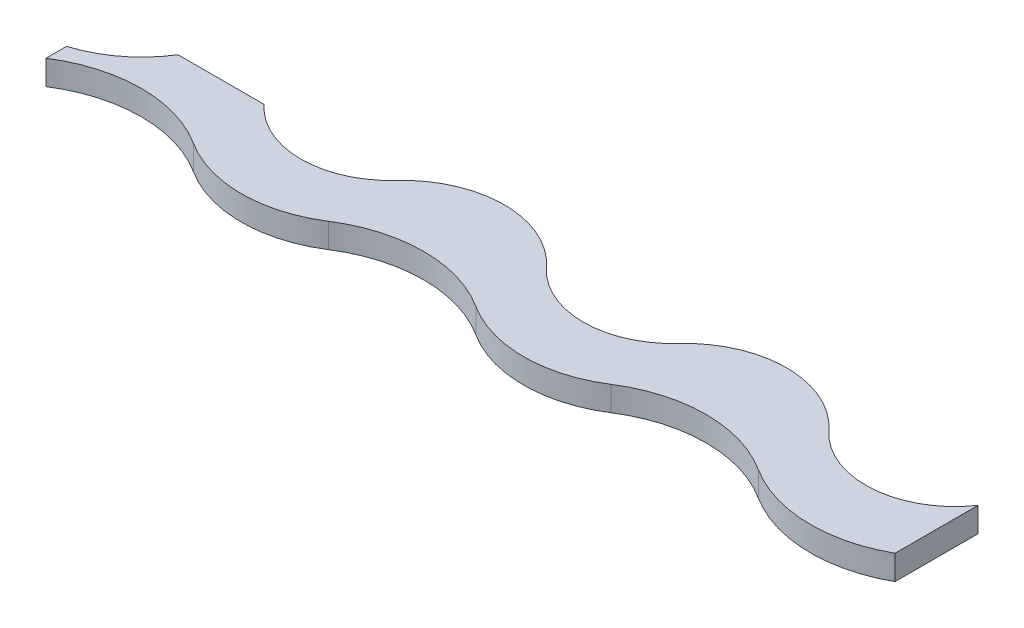
ISO-10303-21;
HEADER;
FILE_DESCRIPTION(('STEP AP214'),'2;1');
FILE_NAME('part.step','',(''),(''),'','','');
FILE_SCHEMA(('AUTOMOTIVE_DESIGN { 1 0 10303 214 1 1 1 1 }'));
ENDSEC;
DATA;
#1=APPLICATION_CONTEXT('core data for automotive mechanical design processes');
#2=APPLICATION_PROTOCOL_DEFINITION('international standard','automotive_design',2000,#1);
#3=PRODUCT_CONTEXT('',#1,'mechanical');
#4=PRODUCT('Part','Part','',(#3));
#5=PRODUCT_RELATED_PRODUCT_CATEGORY('part','',(#4));
#6=PRODUCT_DEFINITION_FORMATION('','',#4);
#7=PRODUCT_DEFINITION_CONTEXT('part definition',#1,'design');
#8=PRODUCT_DEFINITION('design','',#6,#7);
#9=PRODUCT_DEFINITION_SHAPE('','',#8);
#10=(LENGTH_UNIT() NAMED_UNIT(*) SI_UNIT(.MILLI.,.METRE.));
#11=(NAMED_UNIT(*) PLANE_ANGLE_UNIT() SI_UNIT($,.RADIAN.));
#12=(NAMED_UNIT(*) SI_UNIT($,.STERADIAN.) SOLID_ANGLE_UNIT());
#13=UNCERTAINTY_MEASURE_WITH_UNIT(LENGTH_MEASURE(1.E-05),#10,'distance_accuracy_value','');
#14=(GEOMETRIC_REPRESENTATION_CONTEXT(3) GLOBAL_UNCERTAINTY_ASSIGNED_CONTEXT((#13)) GLOBAL_UNIT_ASSIGNED_CONTEXT((#10,
#11,#12)) REPRESENTATION_CONTEXT('',''));
#15=CARTESIAN_POINT('',(0.,0.,0.));
#16=DIRECTION('',(0.,0.,1.));
#17=DIRECTION('',(1.,0.,0.));
#18=AXIS2_PLACEMENT_3D('',#15,#16,#17);
#19=CARTESIAN_POINT('',(57.37,2.,-19.8781689297581));
#20=DIRECTION('',(0.,-1.,0.));
#21=DIRECTION('',(0.,0.,-1.));
#22=AXIS2_PLACEMENT_3D('',#19,#20,#21);
#23=CYLINDRICAL_SURFACE('',#22,7.25);
#24=CARTESIAN_POINT('',(57.37,0.,-19.8781689297581));
#25=DIRECTION('',(0.,1.,0.));
#26=DIRECTION('',(0.,0.,1.));
#27=AXIS2_PLACEMENT_3D('',#24,#25,#26);
#28=CIRCLE('',#27,7.25);
#29=CARTESIAN_POINT('',(52.0205387347556,0.,-14.9847279960541));
#30=VERTEX_POINT('',#29);
#31=CARTESIAN_POINT('',(63.34697854301,0.,-15.7747279960541));
#32=VERTEX_POINT('',#31);
#33=EDGE_CURVE('E195',#30,#32,#28,.T.);
#34=ORIENTED_EDGE('',*,*,#33,.F.);
#35=DIRECTION('',(0.,-1.,0.));
#36=VECTOR('',#35,1.);
#37=CARTESIAN_POINT('',(52.0205387347556,2.,-14.9847279960541));
#38=LINE('',#37,#36);
#39=CARTESIAN_POINT('',(52.0205387347556,2.,-14.9847279960541));
#40=VERTEX_POINT('',#39);
#41=EDGE_CURVE('E11',#40,#30,#38,.T.);
#42=ORIENTED_EDGE('',*,*,#41,.F.);
#43=CARTESIAN_POINT('',(57.37,2.,-19.8781689297581));
#44=DIRECTION('',(0.,1.,0.));
#45=DIRECTION('',(0.,0.,1.));
#46=AXIS2_PLACEMENT_3D('',#43,#44,#45);
#47=CIRCLE('',#46,7.25);
#48=CARTESIAN_POINT('',(63.34697854301,2.,-15.7747279960541));
#49=VERTEX_POINT('',#48);
#50=EDGE_CURVE('E243',#40,#49,#47,.T.);
#51=ORIENTED_EDGE('',*,*,#50,.T.);
#52=DIRECTION('',(0.,-1.,0.));
#53=VECTOR('',#52,1.);
#54=CARTESIAN_POINT('',(63.34697854301,2.,-15.7747279960541));
#55=LINE('',#54,#53);
#56=EDGE_CURVE('E52',#49,#32,#55,.T.);
#57=ORIENTED_EDGE('',*,*,#56,.T.);
#58=EDGE_LOOP('',(#34,#42,#51,#57));
#59=FACE_BOUND('',#58,.T.);
#60=ADVANCED_FACE('F49',(#59),#23,.F.);
#61=CARTESIAN_POINT('',(45.895,2.,-9.3813671155125));
#62=DIRECTION('',(0.,-1.,0.));
#63=DIRECTION('',(0.,0.,-1.));
#64=AXIS2_PLACEMENT_3D('',#61,#62,#63);
#65=CYLINDRICAL_SURFACE('',#64,8.30179968130858);
#66=CARTESIAN_POINT('',(45.895,0.,-9.3813671155125));
#67=DIRECTION('',(0.,1.,0.));
#68=DIRECTION('',(0.,0.,1.));
#69=AXIS2_PLACEMENT_3D('',#66,#67,#68);
#70=CIRCLE('',#69,8.30179968130858);
#71=CARTESIAN_POINT('',(39.7694612652444,0.,-14.9847279960541));
#72=VERTEX_POINT('',#71);
#73=EDGE_CURVE('E116',#30,#72,#70,.T.);
#74=ORIENTED_EDGE('',*,*,#73,.T.);
#75=DIRECTION('',(0.,-1.,0.));
#76=VECTOR('',#75,1.);
#77=CARTESIAN_POINT('',(39.7694612652444,2.,-14.9847279960541));
#78=LINE('',#77,#76);
#79=CARTESIAN_POINT('',(39.7694612652444,2.,-14.9847279960541));
#80=VERTEX_POINT('',#79);
#81=EDGE_CURVE('E59',#80,#72,#78,.T.);
#82=ORIENTED_EDGE('',*,*,#81,.F.);
#83=CARTESIAN_POINT('',(45.895,2.,-9.3813671155125));
#84=DIRECTION('',(0.,1.,0.));
#85=DIRECTION('',(0.,0.,1.));
#86=AXIS2_PLACEMENT_3D('',#83,#84,#85);
#87=CIRCLE('',#86,8.30179968130858);
#88=EDGE_CURVE('E168',#40,#80,#87,.T.);
#89=ORIENTED_EDGE('',*,*,#88,.F.);
#90=ORIENTED_EDGE('',*,*,#41,.T.);
#91=EDGE_LOOP('',(#74,#82,#89,#90));
#92=FACE_BOUND('',#91,.T.);
#93=ADVANCED_FACE('F375',(#92),#65,.T.);
#94=CARTESIAN_POINT('',(34.42,2.,-19.8781689297581));
#95=DIRECTION('',(0.,-1.,0.));
#96=DIRECTION('',(0.,0.,-1.));
#97=AXIS2_PLACEMENT_3D('',#94,#95,#96);
#98=CYLINDRICAL_SURFACE('',#97,7.25);
#99=CARTESIAN_POINT('',(34.42,0.,-19.8781689297581));
#100=DIRECTION('',(0.,-1.,0.));
#101=DIRECTION('',(0.,0.,-1.));
#102=AXIS2_PLACEMENT_3D('',#99,#100,#101);
#103=CIRCLE('',#102,7.25);
#104=CARTESIAN_POINT('',(29.0705387347556,0.,-14.9847279960541));
#105=VERTEX_POINT('',#104);
#106=EDGE_CURVE('E176',#72,#105,#103,.T.);
#107=ORIENTED_EDGE('',*,*,#106,.T.);
#108=DIRECTION('',(0.,-1.,0.));
#109=VECTOR('',#108,1.);
#110=CARTESIAN_POINT('',(29.0705387347556,2.,-14.9847279960541));
#111=LINE('',#110,#109);
#112=CARTESIAN_POINT('',(29.0705387347556,2.,-14.9847279960541));
#113=VERTEX_POINT('',#112);
#114=EDGE_CURVE('E173',#113,#105,#111,.T.);
#115=ORIENTED_EDGE('',*,*,#114,.F.);
#116=CARTESIAN_POINT('',(34.42,2.,-19.8781689297581));
#117=DIRECTION('',(0.,-1.,0.));
#118=DIRECTION('',(0.,0.,-1.));
#119=AXIS2_PLACEMENT_3D('',#116,#117,#118);
#120=CIRCLE('',#119,7.25);
#121=EDGE_CURVE('E161',#80,#113,#120,.T.);
#122=ORIENTED_EDGE('',*,*,#121,.F.);
#123=ORIENTED_EDGE('',*,*,#81,.T.);
#124=EDGE_LOOP('',(#107,#115,#122,#123));
#125=FACE_BOUND('',#124,.T.);
#126=ADVANCED_FACE('F174',(#125),#98,.F.);
#127=CARTESIAN_POINT('',(22.945,2.,-9.38136711551249));
#128=DIRECTION('',(0.,-1.,0.));
#129=DIRECTION('',(0.,0.,-1.));
#130=AXIS2_PLACEMENT_3D('',#127,#128,#129);
#131=CYLINDRICAL_SURFACE('',#130,8.30179968130858);
#132=CARTESIAN_POINT('',(22.945,0.,-9.38136711551249));
#133=DIRECTION('',(0.,1.,0.));
#134=DIRECTION('',(0.,0.,1.));
#135=AXIS2_PLACEMENT_3D('',#132,#133,#134);
#136=CIRCLE('',#135,8.30179968130858);
#137=CARTESIAN_POINT('',(16.8194612652444,0.,-14.9847279960541));
#138=VERTEX_POINT('',#137);
#139=EDGE_CURVE('E237',#105,#138,#136,.T.);
#140=ORIENTED_EDGE('',*,*,#139,.T.);
#141=DIRECTION('',(0.,-1.,0.));
#142=VECTOR('',#141,1.);
#143=CARTESIAN_POINT('',(16.8194612652444,2.,-14.9847279960541));
#144=LINE('',#143,#142);
#145=CARTESIAN_POINT('',(16.8194612652444,2.,-14.9847279960541));
#146=VERTEX_POINT('',#145);
#147=EDGE_CURVE('E180',#146,#138,#144,.T.);
#148=ORIENTED_EDGE('',*,*,#147,.F.);
#149=CARTESIAN_POINT('',(22.945,2.,-9.38136711551249));
#150=DIRECTION('',(0.,1.,0.));
#151=DIRECTION('',(0.,0.,1.));
#152=AXIS2_PLACEMENT_3D('',#149,#150,#151);
#153=CIRCLE('',#152,8.30179968130858);
#154=EDGE_CURVE('E166',#113,#146,#153,.T.);
#155=ORIENTED_EDGE('',*,*,#154,.F.);
#156=ORIENTED_EDGE('',*,*,#114,.T.);
#157=EDGE_LOOP('',(#140,#148,#155,#156));
#158=FACE_BOUND('',#157,.T.);
#159=ADVANCED_FACE('F182',(#158),#131,.T.);
#160=CARTESIAN_POINT('',(11.47,2.,-19.8781689297581));
#161=DIRECTION('',(0.,-1.,0.));
#162=DIRECTION('',(0.,0.,-1.));
#163=AXIS2_PLACEMENT_3D('',#160,#161,#162);
#164=CYLINDRICAL_SURFACE('',#163,7.25);
#165=CARTESIAN_POINT('',(11.47,0.,-19.8781689297581));
#166=DIRECTION('',(0.,-1.,0.));
#167=DIRECTION('',(0.,0.,-1.));
#168=AXIS2_PLACEMENT_3D('',#165,#166,#167);
#169=CIRCLE('',#168,7.25);
#170=CARTESIAN_POINT('',(6.12053873475563,0.,-14.9847279960541));
#171=VERTEX_POINT('',#170);
#172=EDGE_CURVE('E234',#138,#171,#169,.T.);
#173=ORIENTED_EDGE('',*,*,#172,.T.);
#174=DIRECTION('',(0.,-1.,0.));
#175=VECTOR('',#174,1.);
#176=CARTESIAN_POINT('',(6.12053873475563,2.,-14.9847279960541));
#177=LINE('',#176,#175);
#178=CARTESIAN_POINT('',(6.12053873475563,2.,-14.9847279960541));
#179=VERTEX_POINT('',#178);
#180=EDGE_CURVE('E249',#179,#171,#177,.T.);
#181=ORIENTED_EDGE('',*,*,#180,.F.);
#182=CARTESIAN_POINT('',(11.47,2.,-19.8781689297581));
#183=DIRECTION('',(0.,-1.,0.));
#184=DIRECTION('',(0.,0.,-1.));
#185=AXIS2_PLACEMENT_3D('',#182,#183,#184);
#186=CIRCLE('',#185,7.25);
#187=EDGE_CURVE('E186',#146,#179,#186,.T.);
#188=ORIENTED_EDGE('',*,*,#187,.F.);
#189=ORIENTED_EDGE('',*,*,#147,.T.);
#190=EDGE_LOOP('',(#173,#181,#188,#189));
#191=FACE_BOUND('',#190,.T.);
#192=ADVANCED_FACE('F292',(#191),#164,.F.);
#193=CARTESIAN_POINT('',(6.12053873475563,2.,-14.9847279960541));
#194=DIRECTION('',(0.,0.,1.));
#195=DIRECTION('',(1.,0.,0.));
#196=AXIS2_PLACEMENT_3D('',#193,#194,#195);
#197=PLANE('',#196);
#198=DIRECTION('',(-1.,0.,0.));
#199=VECTOR('',#198,1.);
#200=CARTESIAN_POINT('',(6.12053873475563,0.,-14.9847279960541));
#201=LINE('',#200,#199);
#202=CARTESIAN_POINT('',(-0.867605228750022,0.,-14.9847279960541));
#203=VERTEX_POINT('',#202);
#204=EDGE_CURVE('E231',#171,#203,#201,.T.);
#205=ORIENTED_EDGE('',*,*,#204,.T.);
#206=DIRECTION('',(0.,-1.,0.));
#207=VECTOR('',#206,1.);
#208=CARTESIAN_POINT('',(-0.867605228750022,2.,-14.9847279960541));
#209=LINE('',#208,#207);
#210=CARTESIAN_POINT('',(-0.867605228750022,2.,-14.9847279960541));
#211=VERTEX_POINT('',#210);
#212=EDGE_CURVE('E253',#211,#203,#209,.T.);
#213=ORIENTED_EDGE('',*,*,#212,.F.);
#214=DIRECTION('',(-1.,0.,0.));
#215=VECTOR('',#214,1.);
#216=CARTESIAN_POINT('',(6.12053873475563,2.,-14.9847279960541));
#217=LINE('',#216,#215);
#218=EDGE_CURVE('E189',#179,#211,#217,.T.);
#219=ORIENTED_EDGE('',*,*,#218,.F.);
#220=ORIENTED_EDGE('',*,*,#180,.T.);
#221=EDGE_LOOP('',(#205,#213,#219,#220));
#222=FACE_BOUND('',#221,.T.);
#223=ADVANCED_FACE('F302',(#222),#197,.F.);
#224=CARTESIAN_POINT('',(-8.71308502894414,2.,-19.8848245976269));
#225=DIRECTION('',(0.,-1.,0.));
#226=DIRECTION('',(0.,0.,-1.));
#227=AXIS2_PLACEMENT_3D('',#224,#225,#226);
#228=CYLINDRICAL_SURFACE('',#227,9.25);
#229=CARTESIAN_POINT('',(-8.71308502894414,0.,-19.8848245976269));
#230=DIRECTION('',(0.,-1.,0.));
#231=DIRECTION('',(0.,0.,-1.));
#232=AXIS2_PLACEMENT_3D('',#229,#230,#231);
#233=CIRCLE('',#232,9.25);
#234=CARTESIAN_POINT('',(-5.99,0.,-11.0447279960541));
#235=VERTEX_POINT('',#234);
#236=EDGE_CURVE('E227',#203,#235,#233,.T.);
#237=ORIENTED_EDGE('',*,*,#236,.T.);
#238=DIRECTION('',(0.,-1.,0.));
#239=VECTOR('',#238,1.);
#240=CARTESIAN_POINT('',(-5.99,2.,-11.0447279960541));
#241=LINE('',#240,#239);
#242=CARTESIAN_POINT('',(-5.99,2.,-11.0447279960541));
#243=VERTEX_POINT('',#242);
#244=EDGE_CURVE('E257',#243,#235,#241,.T.);
#245=ORIENTED_EDGE('',*,*,#244,.F.);
#246=CARTESIAN_POINT('',(-8.71308502894414,2.,-19.8848245976269));
#247=DIRECTION('',(0.,-1.,0.));
#248=DIRECTION('',(0.,0.,-1.));
#249=AXIS2_PLACEMENT_3D('',#246,#247,#248);
#250=CIRCLE('',#249,9.25);
#251=EDGE_CURVE('E298',#211,#243,#250,.T.);
#252=ORIENTED_EDGE('',*,*,#251,.F.);
#253=ORIENTED_EDGE('',*,*,#212,.T.);
#254=EDGE_LOOP('',(#237,#245,#252,#253));
#255=FACE_BOUND('',#254,.T.);
#256=ADVANCED_FACE('F305',(#255),#228,.F.);
#257=CARTESIAN_POINT('',(-5.99,2.,-9.37472799605407));
#258=DIRECTION('',(-1.,0.,0.));
#259=DIRECTION('',(0.,0.,1.));
#260=AXIS2_PLACEMENT_3D('',#257,#258,#259);
#261=PLANE('',#260);
#262=DIRECTION('',(0.,0.,-1.));
#263=VECTOR('',#262,1.);
#264=CARTESIAN_POINT('',(-5.99,0.,-9.37472799605407));
#265=LINE('',#264,#263);
#266=CARTESIAN_POINT('',(-5.99,0.,-9.37472799605407));
#267=VERTEX_POINT('',#266);
#268=EDGE_CURVE('E223',#267,#235,#265,.T.);
#269=ORIENTED_EDGE('',*,*,#268,.F.);
#270=DIRECTION('',(0.,-1.,0.));
#271=VECTOR('',#270,1.);
#272=CARTESIAN_POINT('',(-5.99,2.,-9.37472799605407));
#273=LINE('',#272,#271);
#274=CARTESIAN_POINT('',(-5.99,2.,-9.37472799605407));
#275=VERTEX_POINT('',#274);
#276=EDGE_CURVE('E260',#275,#267,#273,.T.);
#277=ORIENTED_EDGE('',*,*,#276,.F.);
#278=DIRECTION('',(0.,0.,-1.));
#279=VECTOR('',#278,1.);
#280=CARTESIAN_POINT('',(-5.99,2.,-9.37472799605407));
#281=LINE('',#280,#279);
#282=EDGE_CURVE('E308',#275,#243,#281,.T.);
#283=ORIENTED_EDGE('',*,*,#282,.T.);
#284=ORIENTED_EDGE('',*,*,#244,.T.);
#285=EDGE_LOOP('',(#269,#277,#283,#284));
#286=FACE_BOUND('',#285,.T.);
#287=ADVANCED_FACE('F364',(#286),#261,.T.);
#288=CARTESIAN_POINT('',(0.,2.,0.));
#289=DIRECTION('',(0.,-1.,0.));
#290=DIRECTION('',(0.,0.,-1.));
#291=AXIS2_PLACEMENT_3D('',#288,#289,#290);
#292=CYLINDRICAL_SURFACE('',#291,11.125);
#293=CARTESIAN_POINT('',(0.,0.,0.));
#294=DIRECTION('',(0.,1.,0.));
#295=DIRECTION('',(0.,0.,1.));
#296=AXIS2_PLACEMENT_3D('',#293,#294,#295);
#297=CIRCLE('',#296,11.125);
#298=CARTESIAN_POINT('',(5.99,0.,-9.37472799605407));
#299=VERTEX_POINT('',#298);
#300=EDGE_CURVE('E219',#299,#267,#297,.T.);
#301=ORIENTED_EDGE('',*,*,#300,.F.);
#302=DIRECTION('',(0.,-1.,0.));
#303=VECTOR('',#302,1.);
#304=CARTESIAN_POINT('',(5.99,2.,-9.37472799605407));
#305=LINE('',#304,#303);
#306=CARTESIAN_POINT('',(5.99,2.,-9.37472799605407));
#307=VERTEX_POINT('',#306);
#308=EDGE_CURVE('E263',#307,#299,#305,.T.);
#309=ORIENTED_EDGE('',*,*,#308,.F.);
#310=CARTESIAN_POINT('',(0.,2.,0.));
#311=DIRECTION('',(0.,1.,0.));
#312=DIRECTION('',(0.,0.,1.));
#313=AXIS2_PLACEMENT_3D('',#310,#311,#312);
#314=CIRCLE('',#313,11.125);
#315=EDGE_CURVE('E311',#307,#275,#314,.T.);
#316=ORIENTED_EDGE('',*,*,#315,.T.);
#317=ORIENTED_EDGE('',*,*,#276,.T.);
#318=EDGE_LOOP('',(#301,#309,#316,#317));
#319=FACE_BOUND('',#318,.T.);
#320=ADVANCED_FACE('F359',(#319),#292,.F.);
#321=CARTESIAN_POINT('',(11.475,2.,-17.9590991243273));
#322=DIRECTION('',(0.,-1.,0.));
#323=DIRECTION('',(0.,0.,-1.));
#324=AXIS2_PLACEMENT_3D('',#321,#322,#323);
#325=CYLINDRICAL_SURFACE('',#324,10.1870826377295);
#326=CARTESIAN_POINT('',(11.475,0.,-17.9590991243273));
#327=DIRECTION('',(0.,1.,0.));
#328=DIRECTION('',(0.,0.,1.));
#329=AXIS2_PLACEMENT_3D('',#326,#327,#328);
#330=CIRCLE('',#329,10.1870826377295);
#331=CARTESIAN_POINT('',(16.96,0.,-9.37472799605407));
#332=VERTEX_POINT('',#331);
#333=EDGE_CURVE('E216',#299,#332,#330,.T.);
#334=ORIENTED_EDGE('',*,*,#333,.T.);
#335=DIRECTION('',(0.,-1.,0.));
#336=VECTOR('',#335,1.);
#337=CARTESIAN_POINT('',(16.96,2.,-9.37472799605407));
#338=LINE('',#337,#336);
#339=CARTESIAN_POINT('',(16.96,2.,-9.37472799605407));
#340=VERTEX_POINT('',#339);
#341=EDGE_CURVE('E266',#340,#332,#338,.T.);
#342=ORIENTED_EDGE('',*,*,#341,.F.);
#343=CARTESIAN_POINT('',(11.475,2.,-17.9590991243273));
#344=DIRECTION('',(0.,1.,0.));
#345=DIRECTION('',(0.,0.,1.));
#346=AXIS2_PLACEMENT_3D('',#343,#344,#345);
#347=CIRCLE('',#346,10.1870826377295);
#348=EDGE_CURVE('E317',#307,#340,#347,.T.);
#349=ORIENTED_EDGE('',*,*,#348,.F.);
#350=ORIENTED_EDGE('',*,*,#308,.T.);
#351=EDGE_LOOP('',(#334,#342,#349,#350));
#352=FACE_BOUND('',#351,.T.);
#353=ADVANCED_FACE('F365',(#352),#325,.T.);
#354=CARTESIAN_POINT('',(22.95,2.,0.));
#355=DIRECTION('',(0.,-1.,0.));
#356=DIRECTION('',(0.,0.,-1.));
#357=AXIS2_PLACEMENT_3D('',#354,#355,#356);
#358=CYLINDRICAL_SURFACE('',#357,11.125);
#359=CARTESIAN_POINT('',(22.95,0.,0.));
#360=DIRECTION('',(0.,-1.,0.));
#361=DIRECTION('',(0.,0.,-1.));
#362=AXIS2_PLACEMENT_3D('',#359,#360,#361);
#363=CIRCLE('',#362,11.125);
#364=CARTESIAN_POINT('',(28.94,0.,-9.37472799605407));
#365=VERTEX_POINT('',#364);
#366=EDGE_CURVE('E213',#332,#365,#363,.T.);
#367=ORIENTED_EDGE('',*,*,#366,.T.);
#368=DIRECTION('',(0.,-1.,0.));
#369=VECTOR('',#368,1.);
#370=CARTESIAN_POINT('',(28.94,2.,-9.37472799605407));
#371=LINE('',#370,#369);
#372=CARTESIAN_POINT('',(28.94,2.,-9.37472799605407));
#373=VERTEX_POINT('',#372);
#374=EDGE_CURVE('E270',#373,#365,#371,.T.);
#375=ORIENTED_EDGE('',*,*,#374,.F.);
#376=CARTESIAN_POINT('',(22.95,2.,0.));
#377=DIRECTION('',(0.,-1.,0.));
#378=DIRECTION('',(0.,0.,-1.));
#379=AXIS2_PLACEMENT_3D('',#376,#377,#378);
#380=CIRCLE('',#379,11.125);
#381=EDGE_CURVE('E320',#340,#373,#380,.T.);
#382=ORIENTED_EDGE('',*,*,#381,.F.);
#383=ORIENTED_EDGE('',*,*,#341,.T.);
#384=EDGE_LOOP('',(#367,#375,#382,#383));
#385=FACE_BOUND('',#384,.T.);
#386=ADVANCED_FACE('F353',(#385),#358,.F.);
#387=CARTESIAN_POINT('',(34.425,2.,-17.9590991243273));
#388=DIRECTION('',(0.,-1.,0.));
#389=DIRECTION('',(0.,0.,-1.));
#390=AXIS2_PLACEMENT_3D('',#387,#388,#389);
#391=CYLINDRICAL_SURFACE('',#390,10.1870826377295);
#392=CARTESIAN_POINT('',(34.425,0.,-17.9590991243273));
#393=DIRECTION('',(0.,1.,0.));
#394=DIRECTION('',(0.,0.,1.));
#395=AXIS2_PLACEMENT_3D('',#392,#393,#394);
#396=CIRCLE('',#395,10.1870826377295);
#397=CARTESIAN_POINT('',(39.91,0.,-9.37472799605407));
#398=VERTEX_POINT('',#397);
#399=EDGE_CURVE('E210',#365,#398,#396,.T.);
#400=ORIENTED_EDGE('',*,*,#399,.T.);
#401=DIRECTION('',(0.,-1.,0.));
#402=VECTOR('',#401,1.);
#403=CARTESIAN_POINT('',(39.91,2.,-9.37472799605407));
#404=LINE('',#403,#402);
#405=CARTESIAN_POINT('',(39.91,2.,-9.37472799605407));
#406=VERTEX_POINT('',#405);
#407=EDGE_CURVE('E274',#406,#398,#404,.T.);
#408=ORIENTED_EDGE('',*,*,#407,.F.);
#409=CARTESIAN_POINT('',(34.425,2.,-17.9590991243273));
#410=DIRECTION('',(0.,1.,0.));
#411=DIRECTION('',(0.,0.,1.));
#412=AXIS2_PLACEMENT_3D('',#409,#410,#411);
#413=CIRCLE('',#412,10.1870826377295);
#414=EDGE_CURVE('E323',#373,#406,#413,.T.);
#415=ORIENTED_EDGE('',*,*,#414,.F.);
#416=ORIENTED_EDGE('',*,*,#374,.T.);
#417=EDGE_LOOP('',(#400,#408,#415,#416));
#418=FACE_BOUND('',#417,.T.);
#419=ADVANCED_FACE('F349',(#418),#391,.T.);
#420=CARTESIAN_POINT('',(45.9,2.,0.));
#421=DIRECTION('',(0.,-1.,0.));
#422=DIRECTION('',(0.,0.,-1.));
#423=AXIS2_PLACEMENT_3D('',#420,#421,#422);
#424=CYLINDRICAL_SURFACE('',#423,11.125);
#425=CARTESIAN_POINT('',(45.9,0.,0.));
#426=DIRECTION('',(0.,-1.,0.));
#427=DIRECTION('',(0.,0.,-1.));
#428=AXIS2_PLACEMENT_3D('',#425,#426,#427);
#429=CIRCLE('',#428,11.125);
#430=CARTESIAN_POINT('',(51.89,0.,-9.37472799605407));
#431=VERTEX_POINT('',#430);
#432=EDGE_CURVE('E207',#398,#431,#429,.T.);
#433=ORIENTED_EDGE('',*,*,#432,.T.);
#434=DIRECTION('',(0.,-1.,0.));
#435=VECTOR('',#434,1.);
#436=CARTESIAN_POINT('',(51.89,2.,-9.37472799605407));
#437=LINE('',#436,#435);
#438=CARTESIAN_POINT('',(51.89,2.,-9.37472799605407));
#439=VERTEX_POINT('',#438);
#440=EDGE_CURVE('E278',#439,#431,#437,.T.);
#441=ORIENTED_EDGE('',*,*,#440,.F.);
#442=CARTESIAN_POINT('',(45.9,2.,0.));
#443=DIRECTION('',(0.,-1.,0.));
#444=DIRECTION('',(0.,0.,-1.));
#445=AXIS2_PLACEMENT_3D('',#442,#443,#444);
#446=CIRCLE('',#445,11.125);
#447=EDGE_CURVE('E326',#406,#439,#446,.T.);
#448=ORIENTED_EDGE('',*,*,#447,.F.);
#449=ORIENTED_EDGE('',*,*,#407,.T.);
#450=EDGE_LOOP('',(#433,#441,#448,#449));
#451=FACE_BOUND('',#450,.T.);
#452=ADVANCED_FACE('F345',(#451),#424,.F.);
#453=CARTESIAN_POINT('',(57.9027998143619,2.,-18.7851391403557));
#454=DIRECTION('',(0.,-1.,0.));
#455=DIRECTION('',(0.,0.,-1.));
#456=AXIS2_PLACEMENT_3D('',#453,#454,#455);
#457=CYLINDRICAL_SURFACE('',#456,11.1673452311813);
#458=CARTESIAN_POINT('',(57.9027998143619,0.,-18.7851391403557));
#459=DIRECTION('',(0.,1.,0.));
#460=DIRECTION('',(0.,0.,1.));
#461=AXIS2_PLACEMENT_3D('',#458,#459,#460);
#462=CIRCLE('',#461,11.1673452311813);
#463=CARTESIAN_POINT('',(63.34697854301,0.,-9.03472799605407));
#464=VERTEX_POINT('',#463);
#465=EDGE_CURVE('E203',#431,#464,#462,.T.);
#466=ORIENTED_EDGE('',*,*,#465,.T.);
#467=DIRECTION('',(0.,-1.,0.));
#468=VECTOR('',#467,1.);
#469=CARTESIAN_POINT('',(63.34697854301,2.,-9.03472799605407));
#470=LINE('',#469,#468);
#471=CARTESIAN_POINT('',(63.34697854301,2.,-9.03472799605407));
#472=VERTEX_POINT('',#471);
#473=EDGE_CURVE('E281',#472,#464,#470,.T.);
#474=ORIENTED_EDGE('',*,*,#473,.F.);
#475=CARTESIAN_POINT('',(57.9027998143619,2.,-18.7851391403557));
#476=DIRECTION('',(0.,1.,0.));
#477=DIRECTION('',(0.,0.,1.));
#478=AXIS2_PLACEMENT_3D('',#475,#476,#477);
#479=CIRCLE('',#478,11.1673452311813);
#480=EDGE_CURVE('E329',#439,#472,#479,.T.);
#481=ORIENTED_EDGE('',*,*,#480,.F.);
#482=ORIENTED_EDGE('',*,*,#440,.T.);
#483=EDGE_LOOP('',(#466,#474,#481,#482));
#484=FACE_BOUND('',#483,.T.);
#485=ADVANCED_FACE('F340',(#484),#457,.T.);
#486=CARTESIAN_POINT('',(63.34697854301,2.,-15.7747279960541));
#487=DIRECTION('',(1.,0.,0.));
#488=DIRECTION('',(0.,0.,-1.));
#489=AXIS2_PLACEMENT_3D('',#486,#487,#488);
#490=PLANE('',#489);
#491=DIRECTION('',(0.,0.,1.));
#492=VECTOR('',#491,1.);
#493=CARTESIAN_POINT('',(63.34697854301,0.,-15.7747279960541));
#494=LINE('',#493,#492);
#495=EDGE_CURVE('E199',#32,#464,#494,.T.);
#496=ORIENTED_EDGE('',*,*,#495,.F.);
#497=ORIENTED_EDGE('',*,*,#56,.F.);
#498=DIRECTION('',(0.,0.,1.));
#499=VECTOR('',#498,1.);
#500=CARTESIAN_POINT('',(63.34697854301,2.,-15.7747279960541));
#501=LINE('',#500,#499);
#502=EDGE_CURVE('E332',#49,#472,#501,.T.);
#503=ORIENTED_EDGE('',*,*,#502,.T.);
#504=ORIENTED_EDGE('',*,*,#473,.T.);
#505=EDGE_LOOP('',(#496,#497,#503,#504));
#506=FACE_BOUND('',#505,.T.);
#507=ADVANCED_FACE('F285',(#506),#490,.T.);
#508=CARTESIAN_POINT('',(57.37,2.,-19.8781689297581));
#509=DIRECTION('',(0.,1.,0.));
#510=DIRECTION('',(0.,0.,1.));
#511=AXIS2_PLACEMENT_3D('',#508,#509,#510);
#512=PLANE('',#511);
#513=ORIENTED_EDGE('',*,*,#50,.F.);
#514=ORIENTED_EDGE('',*,*,#88,.T.);
#515=ORIENTED_EDGE('',*,*,#121,.T.);
#516=ORIENTED_EDGE('',*,*,#154,.T.);
#517=ORIENTED_EDGE('',*,*,#187,.T.);
#518=ORIENTED_EDGE('',*,*,#218,.T.);
#519=ORIENTED_EDGE('',*,*,#251,.T.);
#520=ORIENTED_EDGE('',*,*,#282,.F.);
#521=ORIENTED_EDGE('',*,*,#315,.F.);
#522=ORIENTED_EDGE('',*,*,#348,.T.);
#523=ORIENTED_EDGE('',*,*,#381,.T.);
#524=ORIENTED_EDGE('',*,*,#414,.T.);
#525=ORIENTED_EDGE('',*,*,#447,.T.);
#526=ORIENTED_EDGE('',*,*,#480,.T.);
#527=ORIENTED_EDGE('',*,*,#502,.F.);
#528=EDGE_LOOP('',(#513,#514,#515,#516,#517,#518,#519,#520,#521,#522,#523,#524,#525,#526,#527));
#529=FACE_BOUND('',#528,.T.);
#530=ADVANCED_FACE('F164',(#529),#512,.T.);
#531=CARTESIAN_POINT('',(57.37,0.,-19.8781689297581));
#532=DIRECTION('',(0.,1.,0.));
#533=DIRECTION('',(0.,0.,1.));
#534=AXIS2_PLACEMENT_3D('',#531,#532,#533);
#535=PLANE('',#534);
#536=ORIENTED_EDGE('',*,*,#33,.T.);
#537=ORIENTED_EDGE('',*,*,#495,.T.);
#538=ORIENTED_EDGE('',*,*,#465,.F.);
#539=ORIENTED_EDGE('',*,*,#432,.F.);
#540=ORIENTED_EDGE('',*,*,#399,.F.);
#541=ORIENTED_EDGE('',*,*,#366,.F.);
#542=ORIENTED_EDGE('',*,*,#333,.F.);
#543=ORIENTED_EDGE('',*,*,#300,.T.);
#544=ORIENTED_EDGE('',*,*,#268,.T.);
#545=ORIENTED_EDGE('',*,*,#236,.F.);
#546=ORIENTED_EDGE('',*,*,#204,.F.);
#547=ORIENTED_EDGE('',*,*,#172,.F.);
#548=ORIENTED_EDGE('',*,*,#139,.F.);
#549=ORIENTED_EDGE('',*,*,#106,.F.);
#550=ORIENTED_EDGE('',*,*,#73,.F.);
#551=EDGE_LOOP('',(#536,#537,#538,#539,#540,#541,#542,#543,#544,#545,#546,#547,#548,#549,#550));
#552=FACE_BOUND('',#551,.T.);
#553=ADVANCED_FACE('F288',(#552),#535,.F.);
#554=CLOSED_SHELL('',(#60,#93,#126,#159,#192,#223,#256,#287,#320,#353,#386,#419,#452,#485,#507,
#530,#553));
#555=MANIFOLD_SOLID_BREP('B2',#554);
#556=ADVANCED_BREP_SHAPE_REPRESENTATION('',(#18,#555),#14);
#557=SHAPE_DEFINITION_REPRESENTATION(#9,#556);
ENDSEC;
END-ISO-10303-21;
